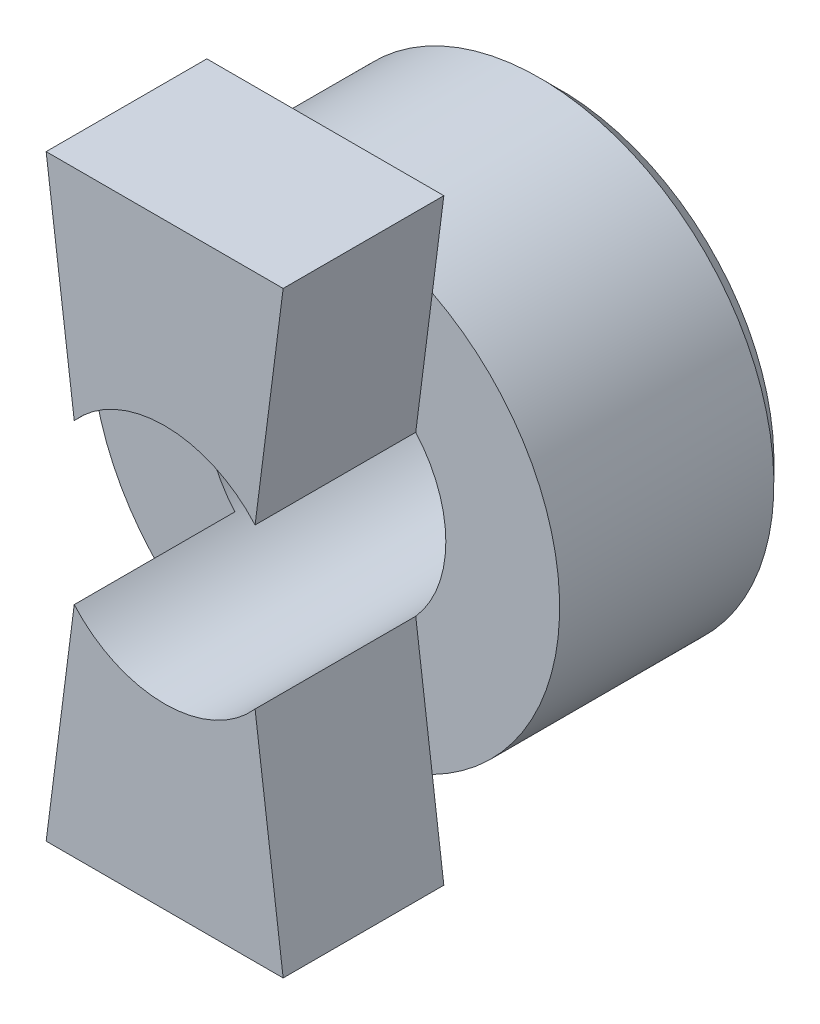
ISO-10303-21;
HEADER;
FILE_DESCRIPTION(('STEP AP214'),'2;1');
FILE_NAME('part.step','',(''),(''),'','','');
FILE_SCHEMA(('AUTOMOTIVE_DESIGN { 1 0 10303 214 1 1 1 1 }'));
ENDSEC;
DATA;
#1=APPLICATION_CONTEXT('core data for automotive mechanical design processes');
#2=APPLICATION_PROTOCOL_DEFINITION('international standard','automotive_design',2000,#1);
#3=PRODUCT_CONTEXT('',#1,'mechanical');
#4=PRODUCT('Part','Part','',(#3));
#5=PRODUCT_RELATED_PRODUCT_CATEGORY('part','',(#4));
#6=PRODUCT_DEFINITION_FORMATION('','',#4);
#7=PRODUCT_DEFINITION_CONTEXT('part definition',#1,'design');
#8=PRODUCT_DEFINITION('design','',#6,#7);
#9=PRODUCT_DEFINITION_SHAPE('','',#8);
#10=(LENGTH_UNIT() NAMED_UNIT(*) SI_UNIT(.MILLI.,.METRE.));
#11=(NAMED_UNIT(*) PLANE_ANGLE_UNIT() SI_UNIT($,.RADIAN.));
#12=(NAMED_UNIT(*) SI_UNIT($,.STERADIAN.) SOLID_ANGLE_UNIT());
#13=UNCERTAINTY_MEASURE_WITH_UNIT(LENGTH_MEASURE(1.E-05),#10,'distance_accuracy_value','');
#14=(GEOMETRIC_REPRESENTATION_CONTEXT(3) GLOBAL_UNCERTAINTY_ASSIGNED_CONTEXT((#13)) GLOBAL_UNIT_ASSIGNED_CONTEXT((#10,
#11,#12)) REPRESENTATION_CONTEXT('',''));
#15=CARTESIAN_POINT('',(0.,0.,0.));
#16=DIRECTION('',(0.,0.,1.));
#17=DIRECTION('',(1.,0.,0.));
#18=AXIS2_PLACEMENT_3D('',#15,#16,#17);
#19=CARTESIAN_POINT('',(9.328,-8.878,-14.76));
#20=DIRECTION('',(0.,0.,-1.));
#21=DIRECTION('',(-1.,0.,0.));
#22=AXIS2_PLACEMENT_3D('',#19,#20,#21);
#23=PLANE('',#22);
#24=CARTESIAN_POINT('',(6.,-5.55,-14.7600000000005));
#25=DIRECTION('',(0.,0.,-1.));
#26=DIRECTION('',(0.,1.,0.));
#27=AXIS2_PLACEMENT_3D('',#24,#25,#26);
#28=CIRCLE('',#27,2.09999999999953);
#29=CARTESIAN_POINT('',(6.,-3.45000000000047,-14.7600000000005));
#30=VERTEX_POINT('',#29);
#31=EDGE_CURVE('E20',#30,#30,#28,.F.);
#32=ORIENTED_EDGE('',*,*,#31,.T.);
#33=EDGE_LOOP('',(#32));
#34=FACE_BOUND('',#33,.T.);
#35=CARTESIAN_POINT('',(6.,-5.55,-14.7600000000005));
#36=DIRECTION('',(0.,0.,1.));
#37=DIRECTION('',(0.,-1.,0.));
#38=AXIS2_PLACEMENT_3D('',#35,#36,#37);
#39=CIRCLE('',#38,3.20000000000047);
#40=CARTESIAN_POINT('',(6.,-8.75000000000047,-14.7600000000005));
#41=VERTEX_POINT('',#40);
#42=EDGE_CURVE('E118',#41,#41,#39,.F.);
#43=ORIENTED_EDGE('',*,*,#42,.T.);
#44=EDGE_LOOP('',(#43));
#45=FACE_BOUND('',#44,.T.);
#46=ADVANCED_FACE('F16',(#34,#45),#23,.T.);
#47=CARTESIAN_POINT('',(4.22161036838,-1.0246,-11.308));
#48=DIRECTION('',(-0.991872066066528,-0.127239162827005,0.));
#49=DIRECTION('',(0.127239162827005,-0.991872066066528,0.));
#50=AXIS2_PLACEMENT_3D('',#47,#48,#49);
#51=PLANE('',#50);
#52=DIRECTION('',(0.127239162827005,-0.991872066066528,0.));
#53=VECTOR('',#52,1.);
#54=CARTESIAN_POINT('',(4.22161036838,-1.0246,-8.86));
#55=LINE('',#54,#53);
#56=CARTESIAN_POINT('',(4.64948158102167,-4.35999999999989,-8.86));
#57=VERTEX_POINT('',#56);
#58=CARTESIAN_POINT('',(4.23000000000021,-1.09,-8.86));
#59=VERTEX_POINT('',#58);
#60=EDGE_CURVE('E87',#57,#59,#55,.F.);
#61=ORIENTED_EDGE('',*,*,#60,.T.);
#62=DIRECTION('',(0.,0.,1.));
#63=VECTOR('',#62,1.);
#64=CARTESIAN_POINT('',(4.23,-1.09,-10.06));
#65=LINE('',#64,#63);
#66=CARTESIAN_POINT('',(4.23000000000021,-1.09,-11.26));
#67=VERTEX_POINT('',#66);
#68=EDGE_CURVE('E154',#59,#67,#65,.F.);
#69=ORIENTED_EDGE('',*,*,#68,.T.);
#70=DIRECTION('',(0.127239162827005,-0.991872066066528,0.));
#71=VECTOR('',#70,1.);
#72=CARTESIAN_POINT('',(4.22161036838,-1.0246,-11.26));
#73=LINE('',#72,#71);
#74=CARTESIAN_POINT('',(4.40263772834132,-2.43576915224919,-11.26));
#75=VERTEX_POINT('',#74);
#76=EDGE_CURVE('E110',#67,#75,#73,.T.);
#77=ORIENTED_EDGE('',*,*,#76,.T.);
#78=DIRECTION('',(0.127239162827005,-0.991872066066528,0.));
#79=VECTOR('',#78,1.);
#80=CARTESIAN_POINT('',(4.22161036838,-1.0246,-11.26));
#81=LINE('',#80,#79);
#82=CARTESIAN_POINT('',(4.64948158102167,-4.35999999999989,-11.26));
#83=VERTEX_POINT('',#82);
#84=EDGE_CURVE('E91',#75,#83,#81,.T.);
#85=ORIENTED_EDGE('',*,*,#84,.T.);
#86=DIRECTION('',(0.,0.,-1.));
#87=VECTOR('',#86,1.);
#88=CARTESIAN_POINT('',(4.64948158102176,-4.35999999999978,-11.66));
#89=LINE('',#88,#87);
#90=EDGE_CURVE('E84',#83,#57,#89,.F.);
#91=ORIENTED_EDGE('',*,*,#90,.T.);
#92=EDGE_LOOP('',(#61,#69,#77,#85,#91));
#93=FACE_BOUND('',#92,.T.);
#94=ADVANCED_FACE('F86',(#93),#51,.T.);
#95=CARTESIAN_POINT('',(4.657871212642,-6.6746,-11.308));
#96=DIRECTION('',(-0.991872066066528,0.127239162827005,0.));
#97=DIRECTION('',(-0.127239162827005,-0.991872066066528,0.));
#98=AXIS2_PLACEMENT_3D('',#95,#96,#97);
#99=PLANE('',#98);
#100=DIRECTION('',(0.,0.,-1.));
#101=VECTOR('',#100,1.);
#102=CARTESIAN_POINT('',(4.23,-10.01,-10.06));
#103=LINE('',#102,#101);
#104=CARTESIAN_POINT('',(4.23000000000021,-10.01,-11.26));
#105=VERTEX_POINT('',#104);
#106=CARTESIAN_POINT('',(4.23000000000021,-10.01,-8.86));
#107=VERTEX_POINT('',#106);
#108=EDGE_CURVE('E156',#105,#107,#103,.F.);
#109=ORIENTED_EDGE('',*,*,#108,.T.);
#110=DIRECTION('',(-0.127239162827005,-0.991872066066528,0.));
#111=VECTOR('',#110,1.);
#112=CARTESIAN_POINT('',(4.657871212642,-6.6746,-8.86));
#113=LINE('',#112,#111);
#114=CARTESIAN_POINT('',(4.64948158102167,-6.74000000000011,-8.86));
#115=VERTEX_POINT('',#114);
#116=EDGE_CURVE('E126',#107,#115,#113,.F.);
#117=ORIENTED_EDGE('',*,*,#116,.T.);
#118=DIRECTION('',(0.,0.,1.));
#119=VECTOR('',#118,1.);
#120=CARTESIAN_POINT('',(4.64948158102176,-6.74000000000021,-11.66));
#121=LINE('',#120,#119);
#122=CARTESIAN_POINT('',(4.64948158102167,-6.74000000000011,-11.26));
#123=VERTEX_POINT('',#122);
#124=EDGE_CURVE('E133',#115,#123,#121,.F.);
#125=ORIENTED_EDGE('',*,*,#124,.T.);
#126=DIRECTION('',(-0.127239162827005,-0.991872066066528,0.));
#127=VECTOR('',#126,1.);
#128=CARTESIAN_POINT('',(4.657871212642,-6.6746,-11.26));
#129=LINE('',#128,#127);
#130=CARTESIAN_POINT('',(4.40263772834102,-8.66423084775066,-11.26));
#131=VERTEX_POINT('',#130);
#132=EDGE_CURVE('E122',#123,#131,#129,.T.);
#133=ORIENTED_EDGE('',*,*,#132,.T.);
#134=DIRECTION('',(-0.127239162827005,-0.991872066066528,0.));
#135=VECTOR('',#134,1.);
#136=CARTESIAN_POINT('',(4.657871212642,-6.6746,-11.26));
#137=LINE('',#136,#135);
#138=EDGE_CURVE('E112',#131,#105,#137,.T.);
#139=ORIENTED_EDGE('',*,*,#138,.T.);
#140=EDGE_LOOP('',(#109,#117,#125,#133,#139));
#141=FACE_BOUND('',#140,.T.);
#142=ADVANCED_FACE('F231',(#141),#99,.T.);
#143=CARTESIAN_POINT('',(6.,-5.55,-14.4599999999995));
#144=DIRECTION('',(0.,0.,-1.));
#145=DIRECTION('',(0.,1.,0.));
#146=AXIS2_PLACEMENT_3D('',#143,#144,#145);
#147=CONICAL_SURFACE('',#146,1.80000000000046,0.785398163394343);
#148=CARTESIAN_POINT('',(6.,-5.55,-14.46));
#149=DIRECTION('',(0.,0.,-1.));
#150=DIRECTION('',(-1.,0.,0.));
#151=AXIS2_PLACEMENT_3D('',#148,#149,#150);
#152=CIRCLE('',#151,1.8);
#153=CARTESIAN_POINT('',(4.2,-5.55,-14.46));
#154=VERTEX_POINT('',#153);
#155=EDGE_CURVE('E136',#154,#154,#152,.F.);
#156=ORIENTED_EDGE('',*,*,#155,.T.);
#157=EDGE_LOOP('',(#156));
#158=FACE_BOUND('',#157,.T.);
#159=ORIENTED_EDGE('',*,*,#31,.F.);
#160=EDGE_LOOP('',(#159));
#161=FACE_BOUND('',#160,.T.);
#162=ADVANCED_FACE('F349',(#158,#161),#147,.F.);
#163=CARTESIAN_POINT('',(4.1592,-10.1884,-8.86));
#164=DIRECTION('',(0.,0.,1.));
#165=DIRECTION('',(1.,0.,0.));
#166=AXIS2_PLACEMENT_3D('',#163,#164,#165);
#167=PLANE('',#166);
#168=DIRECTION('',(1.,0.,0.));
#169=VECTOR('',#168,1.);
#170=CARTESIAN_POINT('',(6.,-1.09,-8.86));
#171=LINE('',#170,#169);
#172=CARTESIAN_POINT('',(7.76999999999959,-1.08999999999996,-8.86));
#173=VERTEX_POINT('',#172);
#174=EDGE_CURVE('E103',#173,#59,#171,.F.);
#175=ORIENTED_EDGE('',*,*,#174,.T.);
#176=ORIENTED_EDGE('',*,*,#60,.F.);
#177=CARTESIAN_POINT('',(6.,-5.55,-8.86));
#178=DIRECTION('',(0.,0.,-1.));
#179=DIRECTION('',(-1.,0.,0.));
#180=AXIS2_PLACEMENT_3D('',#177,#178,#179);
#181=CIRCLE('',#180,1.8);
#182=CARTESIAN_POINT('',(7.35051841897842,-4.36000000000002,-8.86));
#183=VERTEX_POINT('',#182);
#184=EDGE_CURVE('E95',#183,#57,#181,.F.);
#185=ORIENTED_EDGE('',*,*,#184,.F.);
#186=DIRECTION('',(-0.127239162827005,-0.991872066066528,0.));
#187=VECTOR('',#186,1.);
#188=CARTESIAN_POINT('',(7.560259209489,-2.725,-8.86));
#189=LINE('',#188,#187);
#190=EDGE_CURVE('E162',#183,#173,#189,.F.);
#191=ORIENTED_EDGE('',*,*,#190,.T.);
#192=EDGE_LOOP('',(#175,#176,#185,#191));
#193=FACE_BOUND('',#192,.T.);
#194=ADVANCED_FACE('F99',(#193),#167,.T.);
#195=CARTESIAN_POINT('',(7.8408,-1.09,-11.308));
#196=DIRECTION('',(0.,1.,0.));
#197=DIRECTION('',(-1.,0.,0.));
#198=AXIS2_PLACEMENT_3D('',#195,#196,#197);
#199=PLANE('',#198);
#200=ORIENTED_EDGE('',*,*,#174,.F.);
#201=DIRECTION('',(0.,0.,1.));
#202=VECTOR('',#201,1.);
#203=CARTESIAN_POINT('',(7.76999999999958,-1.08999999999995,-10.06));
#204=LINE('',#203,#202);
#205=CARTESIAN_POINT('',(7.76999999999959,-1.08999999999996,-11.26));
#206=VERTEX_POINT('',#205);
#207=EDGE_CURVE('E164',#173,#206,#204,.F.);
#208=ORIENTED_EDGE('',*,*,#207,.T.);
#209=DIRECTION('',(-1.,0.,0.));
#210=VECTOR('',#209,1.);
#211=CARTESIAN_POINT('',(6.,-1.09,-11.26));
#212=LINE('',#211,#210);
#213=EDGE_CURVE('E113',#206,#67,#212,.T.);
#214=ORIENTED_EDGE('',*,*,#213,.T.);
#215=ORIENTED_EDGE('',*,*,#68,.F.);
#216=EDGE_LOOP('',(#200,#208,#214,#215));
#217=FACE_BOUND('',#216,.T.);
#218=ADVANCED_FACE('F223',(#217),#199,.T.);
#219=CARTESIAN_POINT('',(4.1592,-10.1884,-11.26));
#220=DIRECTION('',(0.,0.,1.));
#221=DIRECTION('',(1.,0.,0.));
#222=AXIS2_PLACEMENT_3D('',#219,#220,#221);
#223=PLANE('',#222);
#224=ORIENTED_EDGE('',*,*,#213,.F.);
#225=DIRECTION('',(0.127239162827005,0.991872066066528,0.));
#226=VECTOR('',#225,1.);
#227=CARTESIAN_POINT('',(7.560259209489,-2.725,-11.26));
#228=LINE('',#227,#226);
#229=CARTESIAN_POINT('',(7.59736227165898,-2.43576915224934,-11.26));
#230=VERTEX_POINT('',#229);
#231=EDGE_CURVE('E141',#206,#230,#228,.F.);
#232=ORIENTED_EDGE('',*,*,#231,.T.);
#233=CARTESIAN_POINT('',(6.,-5.55,-11.26));
#234=DIRECTION('',(0.,0.,-1.));
#235=DIRECTION('',(-1.,0.,0.));
#236=AXIS2_PLACEMENT_3D('',#233,#234,#235);
#237=CIRCLE('',#236,3.5);
#238=EDGE_CURVE('E137',#230,#75,#237,.F.);
#239=ORIENTED_EDGE('',*,*,#238,.T.);
#240=ORIENTED_EDGE('',*,*,#76,.F.);
#241=EDGE_LOOP('',(#224,#232,#239,#240));
#242=FACE_BOUND('',#241,.T.);
#243=ADVANCED_FACE('F226',(#242),#223,.F.);
#244=CARTESIAN_POINT('',(4.1592,-10.1884,-11.26));
#245=DIRECTION('',(0.,0.,1.));
#246=DIRECTION('',(1.,0.,0.));
#247=AXIS2_PLACEMENT_3D('',#244,#245,#246);
#248=PLANE('',#247);
#249=DIRECTION('',(1.,0.,0.));
#250=VECTOR('',#249,1.);
#251=CARTESIAN_POINT('',(6.,-10.01,-11.26));
#252=LINE('',#251,#250);
#253=CARTESIAN_POINT('',(7.76999999999958,-10.01,-11.26));
#254=VERTEX_POINT('',#253);
#255=EDGE_CURVE('E125',#254,#105,#252,.F.);
#256=ORIENTED_EDGE('',*,*,#255,.T.);
#257=ORIENTED_EDGE('',*,*,#138,.F.);
#258=CARTESIAN_POINT('',(6.,-5.55,-11.26));
#259=DIRECTION('',(0.,0.,-1.));
#260=DIRECTION('',(-1.,0.,0.));
#261=AXIS2_PLACEMENT_3D('',#258,#259,#260);
#262=CIRCLE('',#261,3.5);
#263=CARTESIAN_POINT('',(7.59736227165869,-8.66423084775081,-11.26));
#264=VERTEX_POINT('',#263);
#265=EDGE_CURVE('E140',#131,#264,#262,.F.);
#266=ORIENTED_EDGE('',*,*,#265,.T.);
#267=DIRECTION('',(-0.127239162827005,0.991872066066528,0.));
#268=VECTOR('',#267,1.);
#269=CARTESIAN_POINT('',(7.77838963162,-10.0754,-11.26));
#270=LINE('',#269,#268);
#271=EDGE_CURVE('E115',#254,#264,#270,.T.);
#272=ORIENTED_EDGE('',*,*,#271,.F.);
#273=EDGE_LOOP('',(#256,#257,#266,#272));
#274=FACE_BOUND('',#273,.T.);
#275=ADVANCED_FACE('F238',(#274),#248,.F.);
#276=CARTESIAN_POINT('',(6.,-5.55,-14.4599999999995));
#277=DIRECTION('',(0.,0.,1.));
#278=DIRECTION('',(0.,-1.,0.));
#279=AXIS2_PLACEMENT_3D('',#276,#277,#278);
#280=CONICAL_SURFACE('',#279,3.49999999999953,0.785398163394341);
#281=CARTESIAN_POINT('',(6.,-5.55,-14.46));
#282=DIRECTION('',(0.,0.,-1.));
#283=DIRECTION('',(-1.,0.,0.));
#284=AXIS2_PLACEMENT_3D('',#281,#282,#283);
#285=CIRCLE('',#284,3.5);
#286=CARTESIAN_POINT('',(2.5,-5.55,-14.46));
#287=VERTEX_POINT('',#286);
#288=EDGE_CURVE('E144',#287,#287,#285,.T.);
#289=ORIENTED_EDGE('',*,*,#288,.T.);
#290=EDGE_LOOP('',(#289));
#291=FACE_BOUND('',#290,.T.);
#292=ORIENTED_EDGE('',*,*,#42,.F.);
#293=EDGE_LOOP('',(#292));
#294=FACE_BOUND('',#293,.T.);
#295=ADVANCED_FACE('F240',(#291,#294),#280,.T.);
#296=CARTESIAN_POINT('',(9.64,-8.788800081661,-11.26));
#297=DIRECTION('',(0.,0.,-1.));
#298=DIRECTION('',(-1.,0.,0.));
#299=AXIS2_PLACEMENT_3D('',#296,#297,#298);
#300=PLANE('',#299);
#301=CARTESIAN_POINT('',(6.,-5.55,-11.26));
#302=DIRECTION('',(0.,0.,-1.));
#303=DIRECTION('',(-1.,0.,0.));
#304=AXIS2_PLACEMENT_3D('',#301,#302,#303);
#305=CIRCLE('',#304,3.5);
#306=EDGE_CURVE('E145',#75,#131,#305,.F.);
#307=ORIENTED_EDGE('',*,*,#306,.T.);
#308=ORIENTED_EDGE('',*,*,#132,.F.);
#309=CARTESIAN_POINT('',(6.,-5.55,-11.26));
#310=DIRECTION('',(0.,0.,-1.));
#311=DIRECTION('',(-1.,0.,0.));
#312=AXIS2_PLACEMENT_3D('',#309,#310,#311);
#313=CIRCLE('',#312,1.8);
#314=EDGE_CURVE('E134',#123,#83,#313,.T.);
#315=ORIENTED_EDGE('',*,*,#314,.T.);
#316=ORIENTED_EDGE('',*,*,#84,.F.);
#317=EDGE_LOOP('',(#307,#308,#315,#316));
#318=FACE_BOUND('',#317,.T.);
#319=ADVANCED_FACE('F229',(#318),#300,.F.);
#320=CARTESIAN_POINT('',(4.1592,-10.01,-11.308));
#321=DIRECTION('',(0.,-1.,0.));
#322=DIRECTION('',(1.,0.,0.));
#323=AXIS2_PLACEMENT_3D('',#320,#321,#322);
#324=PLANE('',#323);
#325=DIRECTION('',(1.,0.,0.));
#326=VECTOR('',#325,1.);
#327=CARTESIAN_POINT('',(6.,-10.01,-8.86));
#328=LINE('',#327,#326);
#329=CARTESIAN_POINT('',(7.76999999999959,-10.01,-8.86));
#330=VERTEX_POINT('',#329);
#331=EDGE_CURVE('E128',#330,#107,#328,.F.);
#332=ORIENTED_EDGE('',*,*,#331,.T.);
#333=ORIENTED_EDGE('',*,*,#108,.F.);
#334=ORIENTED_EDGE('',*,*,#255,.F.);
#335=DIRECTION('',(0.,0.,-1.));
#336=VECTOR('',#335,1.);
#337=CARTESIAN_POINT('',(7.76999999999958,-10.0100000000001,-10.06));
#338=LINE('',#337,#336);
#339=EDGE_CURVE('E148',#254,#330,#338,.F.);
#340=ORIENTED_EDGE('',*,*,#339,.T.);
#341=EDGE_LOOP('',(#332,#333,#334,#340));
#342=FACE_BOUND('',#341,.T.);
#343=ADVANCED_FACE('F235',(#342),#324,.T.);
#344=CARTESIAN_POINT('',(4.1592,-10.1884,-8.86));
#345=DIRECTION('',(0.,0.,1.));
#346=DIRECTION('',(1.,0.,0.));
#347=AXIS2_PLACEMENT_3D('',#344,#345,#346);
#348=PLANE('',#347);
#349=ORIENTED_EDGE('',*,*,#331,.F.);
#350=DIRECTION('',(0.127239162827005,-0.991872066066528,0.));
#351=VECTOR('',#350,1.);
#352=CARTESIAN_POINT('',(7.560259209489,-8.375,-8.86));
#353=LINE('',#352,#351);
#354=CARTESIAN_POINT('',(7.35051841897842,-6.73999999999998,-8.86));
#355=VERTEX_POINT('',#354);
#356=EDGE_CURVE('E184',#330,#355,#353,.F.);
#357=ORIENTED_EDGE('',*,*,#356,.T.);
#358=CARTESIAN_POINT('',(6.,-5.55,-8.86));
#359=DIRECTION('',(0.,0.,-1.));
#360=DIRECTION('',(-1.,0.,0.));
#361=AXIS2_PLACEMENT_3D('',#358,#359,#360);
#362=CIRCLE('',#361,1.8);
#363=EDGE_CURVE('E130',#355,#115,#362,.T.);
#364=ORIENTED_EDGE('',*,*,#363,.T.);
#365=ORIENTED_EDGE('',*,*,#116,.F.);
#366=EDGE_LOOP('',(#349,#357,#364,#365));
#367=FACE_BOUND('',#366,.T.);
#368=ADVANCED_FACE('F233',(#367),#348,.T.);
#369=CARTESIAN_POINT('',(6.,-5.55,-8.86));
#370=DIRECTION('',(0.,0.,-1.));
#371=DIRECTION('',(-1.,0.,0.));
#372=AXIS2_PLACEMENT_3D('',#369,#370,#371);
#373=CYLINDRICAL_SURFACE('',#372,1.8);
#374=ORIENTED_EDGE('',*,*,#155,.F.);
#375=EDGE_LOOP('',(#374));
#376=FACE_BOUND('',#375,.T.);
#377=ORIENTED_EDGE('',*,*,#90,.F.);
#378=ORIENTED_EDGE('',*,*,#314,.F.);
#379=ORIENTED_EDGE('',*,*,#124,.F.);
#380=ORIENTED_EDGE('',*,*,#363,.F.);
#381=DIRECTION('',(0.,0.,1.));
#382=VECTOR('',#381,1.);
#383=CARTESIAN_POINT('',(7.35051841897842,-6.73999999999995,-10.06));
#384=LINE('',#383,#382);
#385=CARTESIAN_POINT('',(7.35051841897842,-6.73999999999998,-11.26));
#386=VERTEX_POINT('',#385);
#387=EDGE_CURVE('E152',#355,#386,#384,.F.);
#388=ORIENTED_EDGE('',*,*,#387,.T.);
#389=CARTESIAN_POINT('',(6.,-5.55,-11.26));
#390=DIRECTION('',(0.,0.,-1.));
#391=DIRECTION('',(-1.,0.,0.));
#392=AXIS2_PLACEMENT_3D('',#389,#390,#391);
#393=CIRCLE('',#392,1.8);
#394=CARTESIAN_POINT('',(7.35051841897842,-4.36000000000002,-11.26));
#395=VERTEX_POINT('',#394);
#396=EDGE_CURVE('E35',#395,#386,#393,.T.);
#397=ORIENTED_EDGE('',*,*,#396,.F.);
#398=DIRECTION('',(0.,0.,-1.));
#399=VECTOR('',#398,1.);
#400=CARTESIAN_POINT('',(7.35051841897842,-4.36000000000005,-10.06));
#401=LINE('',#400,#399);
#402=EDGE_CURVE('E108',#395,#183,#401,.F.);
#403=ORIENTED_EDGE('',*,*,#402,.T.);
#404=ORIENTED_EDGE('',*,*,#184,.T.);
#405=EDGE_LOOP('',(#377,#378,#379,#380,#388,#397,#403,#404));
#406=FACE_BOUND('',#405,.T.);
#407=ADVANCED_FACE('F106',(#376,#406),#373,.F.);
#408=CARTESIAN_POINT('',(7.342128787358,-4.4254,-11.308));
#409=DIRECTION('',(0.991872066066528,-0.127239162827005,0.));
#410=DIRECTION('',(0.127239162827005,0.991872066066528,0.));
#411=AXIS2_PLACEMENT_3D('',#408,#409,#410);
#412=PLANE('',#411);
#413=ORIENTED_EDGE('',*,*,#207,.F.);
#414=ORIENTED_EDGE('',*,*,#190,.F.);
#415=ORIENTED_EDGE('',*,*,#402,.F.);
#416=DIRECTION('',(0.127239162827005,0.991872066066528,0.));
#417=VECTOR('',#416,1.);
#418=CARTESIAN_POINT('',(7.342128787358,-4.4254,-11.26));
#419=LINE('',#418,#417);
#420=EDGE_CURVE('E149',#395,#230,#419,.T.);
#421=ORIENTED_EDGE('',*,*,#420,.T.);
#422=ORIENTED_EDGE('',*,*,#231,.F.);
#423=EDGE_LOOP('',(#413,#414,#415,#421,#422));
#424=FACE_BOUND('',#423,.T.);
#425=ADVANCED_FACE('F214',(#424),#412,.T.);
#426=CARTESIAN_POINT('',(6.,-5.55,-11.26));
#427=DIRECTION('',(0.,0.,-1.));
#428=DIRECTION('',(-1.,0.,0.));
#429=AXIS2_PLACEMENT_3D('',#426,#427,#428);
#430=CYLINDRICAL_SURFACE('',#429,3.5);
#431=ORIENTED_EDGE('',*,*,#288,.F.);
#432=EDGE_LOOP('',(#431));
#433=FACE_BOUND('',#432,.T.);
#434=ORIENTED_EDGE('',*,*,#306,.F.);
#435=ORIENTED_EDGE('',*,*,#238,.F.);
#436=CARTESIAN_POINT('',(6.,-5.55,-11.26));
#437=DIRECTION('',(0.,0.,-1.));
#438=DIRECTION('',(-1.,0.,0.));
#439=AXIS2_PLACEMENT_3D('',#436,#437,#438);
#440=CIRCLE('',#439,3.5);
#441=EDGE_CURVE('E26',#230,#264,#440,.T.);
#442=ORIENTED_EDGE('',*,*,#441,.T.);
#443=ORIENTED_EDGE('',*,*,#265,.F.);
#444=EDGE_LOOP('',(#434,#435,#442,#443));
#445=FACE_BOUND('',#444,.T.);
#446=ADVANCED_FACE('F227',(#433,#445),#430,.T.);
#447=CARTESIAN_POINT('',(7.77838963162,-10.0754,-11.308));
#448=DIRECTION('',(0.991872066066528,0.127239162827005,0.));
#449=DIRECTION('',(-0.127239162827005,0.991872066066528,0.));
#450=AXIS2_PLACEMENT_3D('',#447,#448,#449);
#451=PLANE('',#450);
#452=ORIENTED_EDGE('',*,*,#356,.F.);
#453=ORIENTED_EDGE('',*,*,#339,.F.);
#454=ORIENTED_EDGE('',*,*,#271,.T.);
#455=DIRECTION('',(-0.127239162827005,0.991872066066528,0.));
#456=VECTOR('',#455,1.);
#457=CARTESIAN_POINT('',(7.77838963162,-10.0754,-11.26));
#458=LINE('',#457,#456);
#459=EDGE_CURVE('E11',#264,#386,#458,.T.);
#460=ORIENTED_EDGE('',*,*,#459,.T.);
#461=ORIENTED_EDGE('',*,*,#387,.F.);
#462=EDGE_LOOP('',(#452,#453,#454,#460,#461));
#463=FACE_BOUND('',#462,.T.);
#464=ADVANCED_FACE('F205',(#463),#451,.T.);
#465=CARTESIAN_POINT('',(9.64,-8.788800081661,-11.26));
#466=DIRECTION('',(0.,0.,-1.));
#467=DIRECTION('',(-1.,0.,0.));
#468=AXIS2_PLACEMENT_3D('',#465,#466,#467);
#469=PLANE('',#468);
#470=ORIENTED_EDGE('',*,*,#396,.T.);
#471=ORIENTED_EDGE('',*,*,#459,.F.);
#472=ORIENTED_EDGE('',*,*,#441,.F.);
#473=ORIENTED_EDGE('',*,*,#420,.F.);
#474=EDGE_LOOP('',(#470,#471,#472,#473));
#475=FACE_BOUND('',#474,.T.);
#476=ADVANCED_FACE('F18',(#475),#469,.F.);
#477=CLOSED_SHELL('',(#46,#94,#142,#162,#194,#218,#243,#275,#295,#319,#343,#368,#407,#425,#446,
#464,#476));
#478=MANIFOLD_SOLID_BREP('B1',#477);
#479=ADVANCED_BREP_SHAPE_REPRESENTATION('',(#18,#478),#14);
#480=SHAPE_DEFINITION_REPRESENTATION(#9,#479);
ENDSEC;
END-ISO-10303-21;
